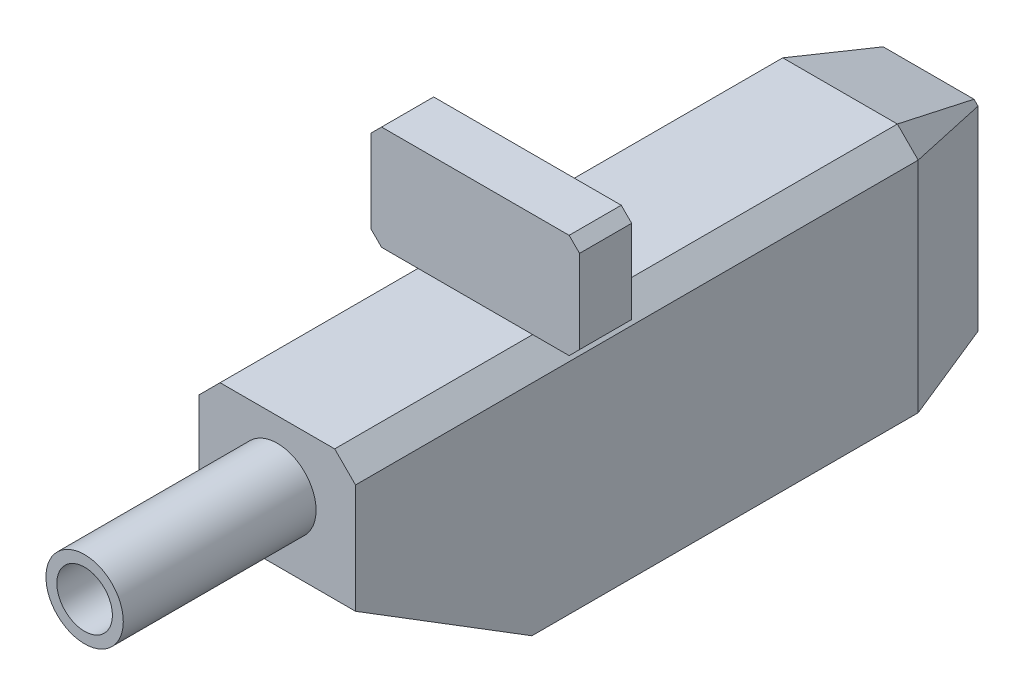
ISO-10303-21;
HEADER;
FILE_DESCRIPTION(('STEP AP214'),'2;1');
FILE_NAME('part.step','',(''),(''),'','','');
FILE_SCHEMA(('AUTOMOTIVE_DESIGN { 1 0 10303 214 1 1 1 1 }'));
ENDSEC;
DATA;
#1=APPLICATION_CONTEXT('core data for automotive mechanical design processes');
#2=APPLICATION_PROTOCOL_DEFINITION('international standard','automotive_design',2000,#1);
#3=PRODUCT_CONTEXT('',#1,'mechanical');
#4=PRODUCT('Part','Part','',(#3));
#5=PRODUCT_RELATED_PRODUCT_CATEGORY('part','',(#4));
#6=PRODUCT_DEFINITION_FORMATION('','',#4);
#7=PRODUCT_DEFINITION_CONTEXT('part definition',#1,'design');
#8=PRODUCT_DEFINITION('design','',#6,#7);
#9=PRODUCT_DEFINITION_SHAPE('','',#8);
#10=(LENGTH_UNIT() NAMED_UNIT(*) SI_UNIT(.MILLI.,.METRE.));
#11=(NAMED_UNIT(*) PLANE_ANGLE_UNIT() SI_UNIT($,.RADIAN.));
#12=(NAMED_UNIT(*) SI_UNIT($,.STERADIAN.) SOLID_ANGLE_UNIT());
#13=UNCERTAINTY_MEASURE_WITH_UNIT(LENGTH_MEASURE(1.E-05),#10,'distance_accuracy_value','');
#14=(GEOMETRIC_REPRESENTATION_CONTEXT(3) GLOBAL_UNCERTAINTY_ASSIGNED_CONTEXT((#13)) GLOBAL_UNIT_ASSIGNED_CONTEXT((#10,
#11,#12)) REPRESENTATION_CONTEXT('',''));
#15=CARTESIAN_POINT('',(0.,0.,0.));
#16=DIRECTION('',(0.,0.,1.));
#17=DIRECTION('',(1.,0.,0.));
#18=AXIS2_PLACEMENT_3D('',#15,#16,#17);
#19=CARTESIAN_POINT('',(-15.,21.,108.));
#20=DIRECTION('',(1.,0.,0.));
#21=DIRECTION('',(0.,1.,0.));
#22=AXIS2_PLACEMENT_3D('',#19,#20,#21);
#23=PLANE('',#22);
#24=DIRECTION('',(0.,-0.527017031886595,-0.849854721762163));
#25=VECTOR('',#24,1.);
#26=CARTESIAN_POINT('',(-15.,0.,108.));
#27=LINE('',#26,#25);
#28=CARTESIAN_POINT('',(-15.,0.,108.));
#29=VERTEX_POINT('',#28);
#30=CARTESIAN_POINT('',(-15.,-21.,74.1359157727454));
#31=VERTEX_POINT('',#30);
#32=EDGE_CURVE('E340',#29,#31,#27,.T.);
#33=ORIENTED_EDGE('',*,*,#32,.F.);
#34=DIRECTION('',(0.,-1.,0.));
#35=VECTOR('',#34,1.);
#36=CARTESIAN_POINT('',(-15.,21.,108.));
#37=LINE('',#36,#35);
#38=CARTESIAN_POINT('',(-15.,21.,108.));
#39=VERTEX_POINT('',#38);
#40=EDGE_CURVE('E248',#39,#29,#37,.T.);
#41=ORIENTED_EDGE('',*,*,#40,.F.);
#42=DIRECTION('',(0.,0.,-1.));
#43=VECTOR('',#42,1.);
#44=CARTESIAN_POINT('',(-15.,21.,108.));
#45=LINE('',#44,#43);
#46=CARTESIAN_POINT('',(-15.,21.,0.));
#47=VERTEX_POINT('',#46);
#48=EDGE_CURVE('E249',#39,#47,#45,.T.);
#49=ORIENTED_EDGE('',*,*,#48,.T.);
#50=DIRECTION('',(0.,-1.,0.));
#51=VECTOR('',#50,1.);
#52=CARTESIAN_POINT('',(-15.,21.,0.));
#53=LINE('',#52,#51);
#54=CARTESIAN_POINT('',(-15.,-21.,0.));
#55=VERTEX_POINT('',#54);
#56=EDGE_CURVE('E300',#47,#55,#53,.T.);
#57=ORIENTED_EDGE('',*,*,#56,.T.);
#58=DIRECTION('',(0.,0.,-1.));
#59=VECTOR('',#58,1.);
#60=CARTESIAN_POINT('',(-15.,-21.,108.));
#61=LINE('',#60,#59);
#62=EDGE_CURVE('E45',#31,#55,#61,.T.);
#63=ORIENTED_EDGE('',*,*,#62,.F.);
#64=EDGE_LOOP('',(#33,#41,#49,#57,#63));
#65=FACE_BOUND('',#64,.T.);
#66=ADVANCED_FACE('F39',(#65),#23,.F.);
#67=CARTESIAN_POINT('',(-15.,-21.,108.));
#68=DIRECTION('',(0.707106781186547,0.707106781186548,0.));
#69=DIRECTION('',(-0.707106781186548,0.707106781186547,0.));
#70=AXIS2_PLACEMENT_3D('',#67,#68,#69);
#71=PLANE('',#70);
#72=DIRECTION('',(0.466232156516168,-0.466232156516167,-0.751834524653243));
#73=VECTOR('',#72,1.);
#74=CARTESIAN_POINT('',(-23.8269268964721,-12.1730731035279,88.3700012913145));
#75=LINE('',#74,#73);
#76=CARTESIAN_POINT('',(-11.,-25.,67.685614015173));
#77=VERTEX_POINT('',#76);
#78=EDGE_CURVE('E210',#31,#77,#75,.T.);
#79=ORIENTED_EDGE('',*,*,#78,.F.);
#80=ORIENTED_EDGE('',*,*,#62,.T.);
#81=DIRECTION('',(0.707106781186548,-0.707106781186547,0.));
#82=VECTOR('',#81,1.);
#83=CARTESIAN_POINT('',(-15.,-21.,0.));
#84=LINE('',#83,#82);
#85=CARTESIAN_POINT('',(-11.,-25.,0.));
#86=VERTEX_POINT('',#85);
#87=EDGE_CURVE('E240',#55,#86,#84,.T.);
#88=ORIENTED_EDGE('',*,*,#87,.T.);
#89=DIRECTION('',(0.,0.,-1.));
#90=VECTOR('',#89,1.);
#91=CARTESIAN_POINT('',(-11.,-25.,108.));
#92=LINE('',#91,#90);
#93=EDGE_CURVE('E264',#77,#86,#92,.T.);
#94=ORIENTED_EDGE('',*,*,#93,.F.);
#95=EDGE_LOOP('',(#79,#80,#88,#94));
#96=FACE_BOUND('',#95,.T.);
#97=ADVANCED_FACE('F296',(#96),#71,.F.);
#98=CARTESIAN_POINT('',(15.,-21.,108.));
#99=DIRECTION('',(-0.707106781186547,0.707106781186548,0.));
#100=DIRECTION('',(-0.707106781186548,-0.707106781186547,0.));
#101=AXIS2_PLACEMENT_3D('',#98,#99,#100);
#102=PLANE('',#101);
#103=DIRECTION('',(0.466232156516168,0.466232156516167,0.751834524653243));
#104=VECTOR('',#103,1.);
#105=CARTESIAN_POINT('',(32.5222585921083,-3.47774140789169,102.391879621074));
#106=LINE('',#105,#104);
#107=CARTESIAN_POINT('',(11.,-25.,67.685614015173));
#108=VERTEX_POINT('',#107);
#109=CARTESIAN_POINT('',(15.,-21.,74.1359157727454));
#110=VERTEX_POINT('',#109);
#111=EDGE_CURVE('E341',#108,#110,#106,.T.);
#112=ORIENTED_EDGE('',*,*,#111,.F.);
#113=DIRECTION('',(0.,0.,-1.));
#114=VECTOR('',#113,1.);
#115=CARTESIAN_POINT('',(11.,-25.,108.));
#116=LINE('',#115,#114);
#117=CARTESIAN_POINT('',(11.,-25.,0.));
#118=VERTEX_POINT('',#117);
#119=EDGE_CURVE('E226',#108,#118,#116,.T.);
#120=ORIENTED_EDGE('',*,*,#119,.T.);
#121=DIRECTION('',(0.707106781186548,0.707106781186547,0.));
#122=VECTOR('',#121,1.);
#123=CARTESIAN_POINT('',(15.,-21.,0.));
#124=LINE('',#123,#122);
#125=CARTESIAN_POINT('',(15.,-21.,0.));
#126=VERTEX_POINT('',#125);
#127=EDGE_CURVE('E202',#118,#126,#124,.T.);
#128=ORIENTED_EDGE('',*,*,#127,.T.);
#129=DIRECTION('',(0.,0.,-1.));
#130=VECTOR('',#129,1.);
#131=CARTESIAN_POINT('',(15.,-21.,108.));
#132=LINE('',#131,#130);
#133=EDGE_CURVE('E223',#110,#126,#132,.T.);
#134=ORIENTED_EDGE('',*,*,#133,.F.);
#135=EDGE_LOOP('',(#112,#120,#128,#134));
#136=FACE_BOUND('',#135,.T.);
#137=ADVANCED_FACE('F235',(#136),#102,.F.);
#138=CARTESIAN_POINT('',(15.,21.,108.));
#139=DIRECTION('',(-1.,0.,0.));
#140=DIRECTION('',(0.,-1.,0.));
#141=AXIS2_PLACEMENT_3D('',#138,#139,#140);
#142=PLANE('',#141);
#143=DIRECTION('',(0.,0.527017031886595,0.849854721762164));
#144=VECTOR('',#143,1.);
#145=CARTESIAN_POINT('',(15.,0.,108.));
#146=LINE('',#145,#144);
#147=CARTESIAN_POINT('',(15.,0.,108.));
#148=VERTEX_POINT('',#147);
#149=EDGE_CURVE('E60',#110,#148,#146,.T.);
#150=ORIENTED_EDGE('',*,*,#149,.F.);
#151=ORIENTED_EDGE('',*,*,#133,.T.);
#152=DIRECTION('',(0.,1.,0.));
#153=VECTOR('',#152,1.);
#154=CARTESIAN_POINT('',(15.,21.,0.));
#155=LINE('',#154,#153);
#156=CARTESIAN_POINT('',(15.,21.,0.));
#157=VERTEX_POINT('',#156);
#158=EDGE_CURVE('E215',#126,#157,#155,.T.);
#159=ORIENTED_EDGE('',*,*,#158,.T.);
#160=DIRECTION('',(0.,0.,-1.));
#161=VECTOR('',#160,1.);
#162=CARTESIAN_POINT('',(15.,21.,108.));
#163=LINE('',#162,#161);
#164=CARTESIAN_POINT('',(15.,21.,108.));
#165=VERTEX_POINT('',#164);
#166=EDGE_CURVE('E230',#165,#157,#163,.T.);
#167=ORIENTED_EDGE('',*,*,#166,.F.);
#168=DIRECTION('',(0.,1.,0.));
#169=VECTOR('',#168,1.);
#170=CARTESIAN_POINT('',(15.,21.,108.));
#171=LINE('',#170,#169);
#172=EDGE_CURVE('E286',#148,#165,#171,.T.);
#173=ORIENTED_EDGE('',*,*,#172,.F.);
#174=EDGE_LOOP('',(#150,#151,#159,#167,#173));
#175=FACE_BOUND('',#174,.T.);
#176=ADVANCED_FACE('F224',(#175),#142,.F.);
#177=CARTESIAN_POINT('',(-11.,25.,108.));
#178=DIRECTION('',(0.,-1.,0.));
#179=DIRECTION('',(0.,0.,-1.));
#180=AXIS2_PLACEMENT_3D('',#177,#178,#179);
#181=PLANE('',#180);
#182=DIRECTION('',(-1.,0.,0.));
#183=VECTOR('',#182,1.);
#184=CARTESIAN_POINT('',(18.,25.,60.0000000000001));
#185=LINE('',#184,#183);
#186=CARTESIAN_POINT('',(11.,25.,60.0000000000001));
#187=VERTEX_POINT('',#186);
#188=CARTESIAN_POINT('',(-11.,25.,60.0000000000001));
#189=VERTEX_POINT('',#188);
#190=EDGE_CURVE('E50',#187,#189,#185,.T.);
#191=ORIENTED_EDGE('',*,*,#190,.F.);
#192=DIRECTION('',(0.,0.,-1.));
#193=VECTOR('',#192,1.);
#194=CARTESIAN_POINT('',(11.,25.,108.));
#195=LINE('',#194,#193);
#196=CARTESIAN_POINT('',(11.,25.,0.));
#197=VERTEX_POINT('',#196);
#198=EDGE_CURVE('E259',#187,#197,#195,.T.);
#199=ORIENTED_EDGE('',*,*,#198,.T.);
#200=DIRECTION('',(-1.,0.,0.));
#201=VECTOR('',#200,1.);
#202=CARTESIAN_POINT('',(-11.,25.,0.));
#203=LINE('',#202,#201);
#204=CARTESIAN_POINT('',(-11.,25.,0.));
#205=VERTEX_POINT('',#204);
#206=EDGE_CURVE('E243',#197,#205,#203,.T.);
#207=ORIENTED_EDGE('',*,*,#206,.T.);
#208=DIRECTION('',(0.,0.,-1.));
#209=VECTOR('',#208,1.);
#210=CARTESIAN_POINT('',(-11.,25.,108.));
#211=LINE('',#210,#209);
#212=EDGE_CURVE('E254',#189,#205,#211,.T.);
#213=ORIENTED_EDGE('',*,*,#212,.F.);
#214=EDGE_LOOP('',(#191,#199,#207,#213));
#215=FACE_BOUND('',#214,.T.);
#216=ADVANCED_FACE('F459',(#215),#181,.F.);
#217=CARTESIAN_POINT('',(-11.,-25.,108.));
#218=DIRECTION('',(0.,1.,0.));
#219=DIRECTION('',(0.,0.,1.));
#220=AXIS2_PLACEMENT_3D('',#217,#218,#219);
#221=PLANE('',#220);
#222=ORIENTED_EDGE('',*,*,#119,.F.);
#223=DIRECTION('',(-1.,0.,0.));
#224=VECTOR('',#223,1.);
#225=CARTESIAN_POINT('',(20.001,-25.,67.685614015173));
#226=LINE('',#225,#224);
#227=EDGE_CURVE('E338',#108,#77,#226,.T.);
#228=ORIENTED_EDGE('',*,*,#227,.T.);
#229=ORIENTED_EDGE('',*,*,#93,.T.);
#230=DIRECTION('',(1.,0.,0.));
#231=VECTOR('',#230,1.);
#232=CARTESIAN_POINT('',(-11.,-25.,0.));
#233=LINE('',#232,#231);
#234=EDGE_CURVE('E232',#86,#118,#233,.T.);
#235=ORIENTED_EDGE('',*,*,#234,.T.);
#236=EDGE_LOOP('',(#222,#228,#229,#235));
#237=FACE_BOUND('',#236,.T.);
#238=ADVANCED_FACE('F578',(#237),#221,.F.);
#239=CARTESIAN_POINT('',(11.,25.,108.));
#240=DIRECTION('',(-0.707106781186548,-0.707106781186548,0.));
#241=DIRECTION('',(0.707106781186548,-0.707106781186548,0.));
#242=AXIS2_PLACEMENT_3D('',#239,#240,#241);
#243=PLANE('',#242);
#244=DIRECTION('',(-0.707106781186548,0.707106781186548,0.));
#245=VECTOR('',#244,1.);
#246=CARTESIAN_POINT('',(11.,25.,0.));
#247=LINE('',#246,#245);
#248=EDGE_CURVE('E219',#157,#197,#247,.T.);
#249=ORIENTED_EDGE('',*,*,#248,.T.);
#250=ORIENTED_EDGE('',*,*,#198,.F.);
#251=CARTESIAN_POINT('',(11.,25.,70.));
#252=VERTEX_POINT('',#251);
#253=EDGE_CURVE('E262',#252,#187,#195,.T.);
#254=ORIENTED_EDGE('',*,*,#253,.F.);
#255=CARTESIAN_POINT('',(11.,25.,108.));
#256=VERTEX_POINT('',#255);
#257=EDGE_CURVE('E258',#256,#252,#195,.T.);
#258=ORIENTED_EDGE('',*,*,#257,.F.);
#259=DIRECTION('',(-0.707106781186548,0.707106781186548,0.));
#260=VECTOR('',#259,1.);
#261=CARTESIAN_POINT('',(11.,25.,108.));
#262=LINE('',#261,#260);
#263=EDGE_CURVE('E292',#165,#256,#262,.T.);
#264=ORIENTED_EDGE('',*,*,#263,.F.);
#265=ORIENTED_EDGE('',*,*,#166,.T.);
#266=EDGE_LOOP('',(#249,#250,#254,#258,#264,#265));
#267=FACE_BOUND('',#266,.T.);
#268=ADVANCED_FACE('F463',(#267),#243,.F.);
#269=ORIENTED_EDGE('',*,*,#257,.T.);
#270=DIRECTION('',(-1.,0.,0.));
#271=VECTOR('',#270,1.);
#272=CARTESIAN_POINT('',(18.,25.,70.));
#273=LINE('',#272,#271);
#274=CARTESIAN_POINT('',(-11.,25.,70.));
#275=VERTEX_POINT('',#274);
#276=EDGE_CURVE('E11',#252,#275,#273,.T.);
#277=ORIENTED_EDGE('',*,*,#276,.T.);
#278=CARTESIAN_POINT('',(-11.,25.,108.));
#279=VERTEX_POINT('',#278);
#280=EDGE_CURVE('E253',#279,#275,#211,.T.);
#281=ORIENTED_EDGE('',*,*,#280,.F.);
#282=DIRECTION('',(-1.,0.,0.));
#283=VECTOR('',#282,1.);
#284=CARTESIAN_POINT('',(-11.,25.,108.));
#285=LINE('',#284,#283);
#286=EDGE_CURVE('E295',#256,#279,#285,.T.);
#287=ORIENTED_EDGE('',*,*,#286,.F.);
#288=EDGE_LOOP('',(#269,#277,#281,#287));
#289=FACE_BOUND('',#288,.T.);
#290=ADVANCED_FACE('F466',(#289),#181,.F.);
#291=CARTESIAN_POINT('',(-11.,25.,108.));
#292=DIRECTION('',(0.707106781186548,-0.707106781186548,0.));
#293=DIRECTION('',(0.707106781186548,0.707106781186548,0.));
#294=AXIS2_PLACEMENT_3D('',#291,#292,#293);
#295=PLANE('',#294);
#296=DIRECTION('',(-0.707106781186548,-0.707106781186548,0.));
#297=VECTOR('',#296,1.);
#298=CARTESIAN_POINT('',(-11.,25.,0.));
#299=LINE('',#298,#297);
#300=EDGE_CURVE('E246',#205,#47,#299,.T.);
#301=ORIENTED_EDGE('',*,*,#300,.T.);
#302=ORIENTED_EDGE('',*,*,#48,.F.);
#303=DIRECTION('',(-0.707106781186548,-0.707106781186548,0.));
#304=VECTOR('',#303,1.);
#305=CARTESIAN_POINT('',(-11.,25.,108.));
#306=LINE('',#305,#304);
#307=EDGE_CURVE('E251',#279,#39,#306,.T.);
#308=ORIENTED_EDGE('',*,*,#307,.F.);
#309=ORIENTED_EDGE('',*,*,#280,.T.);
#310=EDGE_CURVE('E256',#275,#189,#211,.T.);
#311=ORIENTED_EDGE('',*,*,#310,.T.);
#312=ORIENTED_EDGE('',*,*,#212,.T.);
#313=EDGE_LOOP('',(#301,#302,#308,#309,#311,#312));
#314=FACE_BOUND('',#313,.T.);
#315=ADVANCED_FACE('F445',(#314),#295,.F.);
#316=CARTESIAN_POINT('',(0.,0.,108.));
#317=DIRECTION('',(0.,0.,1.));
#318=DIRECTION('',(1.,0.,0.));
#319=AXIS2_PLACEMENT_3D('',#316,#317,#318);
#320=PLANE('',#319);
#321=DIRECTION('',(-1.,0.,0.));
#322=VECTOR('',#321,1.);
#323=CARTESIAN_POINT('',(20.001,0.,108.));
#324=LINE('',#323,#322);
#325=EDGE_CURVE('E339',#148,#29,#324,.T.);
#326=ORIENTED_EDGE('',*,*,#325,.F.);
#327=ORIENTED_EDGE('',*,*,#172,.T.);
#328=ORIENTED_EDGE('',*,*,#263,.T.);
#329=ORIENTED_EDGE('',*,*,#286,.T.);
#330=ORIENTED_EDGE('',*,*,#307,.T.);
#331=ORIENTED_EDGE('',*,*,#40,.T.);
#332=EDGE_LOOP('',(#326,#327,#328,#329,#330,#331));
#333=FACE_BOUND('',#332,.T.);
#334=CARTESIAN_POINT('',(0.,13.0036412121435,108.));
#335=DIRECTION('',(0.,0.,1.));
#336=DIRECTION('',(1.,0.,0.));
#337=AXIS2_PLACEMENT_3D('',#334,#335,#336);
#338=CIRCLE('',#337,7.42429873613658);
#339=CARTESIAN_POINT('',(7.42429873613658,13.0036412121435,108.));
#340=VERTEX_POINT('',#339);
#341=EDGE_CURVE('E275',#340,#340,#338,.T.);
#342=ORIENTED_EDGE('',*,*,#341,.F.);
#343=EDGE_LOOP('',(#342));
#344=FACE_BOUND('',#343,.T.);
#345=ADVANCED_FACE('F423',(#333,#344),#320,.T.);
#346=CARTESIAN_POINT('',(0.,13.0036412121435,145.));
#347=DIRECTION('',(0.,0.,1.));
#348=DIRECTION('',(1.,0.,0.));
#349=AXIS2_PLACEMENT_3D('',#346,#347,#348);
#350=PLANE('',#349);
#351=CARTESIAN_POINT('',(0.,13.0036412121435,145.));
#352=DIRECTION('',(0.,0.,1.));
#353=DIRECTION('',(1.,0.,0.));
#354=AXIS2_PLACEMENT_3D('',#351,#352,#353);
#355=CIRCLE('',#354,7.42429873613658);
#356=CARTESIAN_POINT('',(7.42429873613658,13.0036412121435,145.));
#357=VERTEX_POINT('',#356);
#358=EDGE_CURVE('E287',#357,#357,#355,.T.);
#359=ORIENTED_EDGE('',*,*,#358,.T.);
#360=EDGE_LOOP('',(#359));
#361=FACE_BOUND('',#360,.T.);
#362=CARTESIAN_POINT('',(0.,13.0036412121435,145.));
#363=DIRECTION('',(0.,0.,1.));
#364=DIRECTION('',(1.,0.,0.));
#365=AXIS2_PLACEMENT_3D('',#362,#363,#364);
#366=CIRCLE('',#365,5.33243693779864);
#367=CARTESIAN_POINT('',(5.33243693779864,13.0036412121435,145.));
#368=VERTEX_POINT('',#367);
#369=EDGE_CURVE('E401',#368,#368,#366,.T.);
#370=ORIENTED_EDGE('',*,*,#369,.F.);
#371=EDGE_LOOP('',(#370));
#372=FACE_BOUND('',#371,.T.);
#373=ADVANCED_FACE('F422',(#361,#372),#350,.T.);
#374=CARTESIAN_POINT('',(0.,13.0036412121435,145.));
#375=DIRECTION('',(0.,0.,-1.));
#376=DIRECTION('',(-1.,0.,0.));
#377=AXIS2_PLACEMENT_3D('',#374,#375,#376);
#378=CYLINDRICAL_SURFACE('',#377,7.42429873613658);
#379=ORIENTED_EDGE('',*,*,#358,.F.);
#380=EDGE_LOOP('',(#379));
#381=FACE_BOUND('',#380,.T.);
#382=ORIENTED_EDGE('',*,*,#341,.T.);
#383=EDGE_LOOP('',(#382));
#384=FACE_BOUND('',#383,.T.);
#385=ADVANCED_FACE('F415',(#381,#384),#378,.T.);
#386=CARTESIAN_POINT('',(0.,13.0036412121435,145.));
#387=DIRECTION('',(0.,0.,-1.));
#388=DIRECTION('',(-1.,0.,0.));
#389=AXIS2_PLACEMENT_3D('',#386,#387,#388);
#390=CYLINDRICAL_SURFACE('',#389,5.33243693779864);
#391=ORIENTED_EDGE('',*,*,#369,.T.);
#392=EDGE_LOOP('',(#391));
#393=FACE_BOUND('',#392,.T.);
#394=CARTESIAN_POINT('',(0.,13.0036412121435,108.));
#395=DIRECTION('',(0.,0.,1.));
#396=DIRECTION('',(1.,0.,0.));
#397=AXIS2_PLACEMENT_3D('',#394,#395,#396);
#398=CIRCLE('',#397,5.33243693779864);
#399=CARTESIAN_POINT('',(5.33243693779864,13.0036412121435,108.));
#400=VERTEX_POINT('',#399);
#401=EDGE_CURVE('E405',#400,#400,#398,.T.);
#402=ORIENTED_EDGE('',*,*,#401,.F.);
#403=EDGE_LOOP('',(#402));
#404=FACE_BOUND('',#403,.T.);
#405=ADVANCED_FACE('F408',(#393,#404),#390,.F.);
#406=ORIENTED_EDGE('',*,*,#401,.T.);
#407=EDGE_LOOP('',(#406));
#408=FACE_BOUND('',#407,.T.);
#409=ADVANCED_FACE('F409',(#408),#320,.T.);
#410=CARTESIAN_POINT('',(18.,25.,60.0000000000001));
#411=DIRECTION('',(0.,1.,0.));
#412=DIRECTION('',(0.,0.,1.));
#413=AXIS2_PLACEMENT_3D('',#410,#411,#412);
#414=PLANE('',#413);
#415=CARTESIAN_POINT('',(18.,25.,70.));
#416=VERTEX_POINT('',#415);
#417=EDGE_CURVE('E47',#416,#252,#273,.T.);
#418=ORIENTED_EDGE('',*,*,#417,.T.);
#419=ORIENTED_EDGE('',*,*,#253,.T.);
#420=CARTESIAN_POINT('',(18.,25.,60.0000000000001));
#421=VERTEX_POINT('',#420);
#422=EDGE_CURVE('E285',#421,#187,#185,.T.);
#423=ORIENTED_EDGE('',*,*,#422,.F.);
#424=DIRECTION('',(0.,0.,1.));
#425=VECTOR('',#424,1.);
#426=CARTESIAN_POINT('',(18.,25.,60.0000000000001));
#427=LINE('',#426,#425);
#428=EDGE_CURVE('E392',#421,#416,#427,.T.);
#429=ORIENTED_EDGE('',*,*,#428,.T.);
#430=EDGE_LOOP('',(#418,#419,#423,#429));
#431=FACE_BOUND('',#430,.T.);
#432=ADVANCED_FACE('F419',(#431),#414,.F.);
#433=CARTESIAN_POINT('',(18.,45.,60.0000000000001));
#434=DIRECTION('',(-0.707106781186547,-0.707106781186548,0.));
#435=DIRECTION('',(0.707106781186548,-0.707106781186547,0.));
#436=AXIS2_PLACEMENT_3D('',#433,#434,#435);
#437=PLANE('',#436);
#438=DIRECTION('',(0.707106781186548,-0.707106781186547,0.));
#439=VECTOR('',#438,1.);
#440=CARTESIAN_POINT('',(18.,45.,70.));
#441=LINE('',#440,#439);
#442=CARTESIAN_POINT('',(18.,45.,70.));
#443=VERTEX_POINT('',#442);
#444=CARTESIAN_POINT('',(20.,43.,70.));
#445=VERTEX_POINT('',#444);
#446=EDGE_CURVE('E346',#443,#445,#441,.T.);
#447=ORIENTED_EDGE('',*,*,#446,.T.);
#448=DIRECTION('',(0.,0.,1.));
#449=VECTOR('',#448,1.);
#450=CARTESIAN_POINT('',(20.,43.,60.0000000000001));
#451=LINE('',#450,#449);
#452=CARTESIAN_POINT('',(20.,43.,60.0000000000001));
#453=VERTEX_POINT('',#452);
#454=EDGE_CURVE('E399',#453,#445,#451,.T.);
#455=ORIENTED_EDGE('',*,*,#454,.F.);
#456=DIRECTION('',(0.707106781186548,-0.707106781186547,0.));
#457=VECTOR('',#456,1.);
#458=CARTESIAN_POINT('',(18.,45.,60.0000000000001));
#459=LINE('',#458,#457);
#460=CARTESIAN_POINT('',(18.,45.,60.0000000000001));
#461=VERTEX_POINT('',#460);
#462=EDGE_CURVE('E350',#461,#453,#459,.T.);
#463=ORIENTED_EDGE('',*,*,#462,.F.);
#464=DIRECTION('',(0.,0.,1.));
#465=VECTOR('',#464,1.);
#466=CARTESIAN_POINT('',(18.,45.,60.0000000000001));
#467=LINE('',#466,#465);
#468=EDGE_CURVE('E364',#461,#443,#467,.T.);
#469=ORIENTED_EDGE('',*,*,#468,.T.);
#470=EDGE_LOOP('',(#447,#455,#463,#469));
#471=FACE_BOUND('',#470,.T.);
#472=ADVANCED_FACE('F510',(#471),#437,.F.);
#473=CARTESIAN_POINT('',(20.,43.,60.0000000000001));
#474=DIRECTION('',(-1.,0.,0.));
#475=DIRECTION('',(0.,0.,1.));
#476=AXIS2_PLACEMENT_3D('',#473,#474,#475);
#477=PLANE('',#476);
#478=DIRECTION('',(0.,-1.,0.));
#479=VECTOR('',#478,1.);
#480=CARTESIAN_POINT('',(20.,43.,70.));
#481=LINE('',#480,#479);
#482=CARTESIAN_POINT('',(20.,27.,70.));
#483=VERTEX_POINT('',#482);
#484=EDGE_CURVE('E370',#445,#483,#481,.T.);
#485=ORIENTED_EDGE('',*,*,#484,.T.);
#486=DIRECTION('',(0.,0.,1.));
#487=VECTOR('',#486,1.);
#488=CARTESIAN_POINT('',(20.,27.,60.0000000000001));
#489=LINE('',#488,#487);
#490=CARTESIAN_POINT('',(20.,27.,60.0000000000001));
#491=VERTEX_POINT('',#490);
#492=EDGE_CURVE('E397',#491,#483,#489,.T.);
#493=ORIENTED_EDGE('',*,*,#492,.F.);
#494=DIRECTION('',(0.,-1.,0.));
#495=VECTOR('',#494,1.);
#496=CARTESIAN_POINT('',(20.,43.,60.0000000000001));
#497=LINE('',#496,#495);
#498=EDGE_CURVE('E349',#453,#491,#497,.T.);
#499=ORIENTED_EDGE('',*,*,#498,.F.);
#500=ORIENTED_EDGE('',*,*,#454,.T.);
#501=EDGE_LOOP('',(#485,#493,#499,#500));
#502=FACE_BOUND('',#501,.T.);
#503=ADVANCED_FACE('F503',(#502),#477,.F.);
#504=CARTESIAN_POINT('',(20.,27.,60.0000000000001));
#505=DIRECTION('',(-0.707106781186547,0.707106781186548,0.));
#506=DIRECTION('',(-0.707106781186548,-0.707106781186547,0.));
#507=AXIS2_PLACEMENT_3D('',#504,#505,#506);
#508=PLANE('',#507);
#509=DIRECTION('',(-0.707106781186548,-0.707106781186547,0.));
#510=VECTOR('',#509,1.);
#511=CARTESIAN_POINT('',(20.,27.,70.));
#512=LINE('',#511,#510);
#513=EDGE_CURVE('E367',#483,#416,#512,.T.);
#514=ORIENTED_EDGE('',*,*,#513,.T.);
#515=ORIENTED_EDGE('',*,*,#428,.F.);
#516=DIRECTION('',(-0.707106781186548,-0.707106781186547,0.));
#517=VECTOR('',#516,1.);
#518=CARTESIAN_POINT('',(20.,27.,60.0000000000001));
#519=LINE('',#518,#517);
#520=EDGE_CURVE('E353',#491,#421,#519,.T.);
#521=ORIENTED_EDGE('',*,*,#520,.F.);
#522=ORIENTED_EDGE('',*,*,#492,.T.);
#523=EDGE_LOOP('',(#514,#515,#521,#522));
#524=FACE_BOUND('',#523,.T.);
#525=ADVANCED_FACE('F499',(#524),#508,.F.);
#526=ORIENTED_EDGE('',*,*,#310,.F.);
#527=CARTESIAN_POINT('',(-18.,25.,70.));
#528=VERTEX_POINT('',#527);
#529=EDGE_CURVE('E49',#275,#528,#273,.T.);
#530=ORIENTED_EDGE('',*,*,#529,.T.);
#531=DIRECTION('',(0.,0.,1.));
#532=VECTOR('',#531,1.);
#533=CARTESIAN_POINT('',(-18.,25.,60.0000000000001));
#534=LINE('',#533,#532);
#535=CARTESIAN_POINT('',(-18.,25.,60.0000000000001));
#536=VERTEX_POINT('',#535);
#537=EDGE_CURVE('E388',#536,#528,#534,.T.);
#538=ORIENTED_EDGE('',*,*,#537,.F.);
#539=EDGE_CURVE('E282',#189,#536,#185,.T.);
#540=ORIENTED_EDGE('',*,*,#539,.F.);
#541=EDGE_LOOP('',(#526,#530,#538,#540));
#542=FACE_BOUND('',#541,.T.);
#543=ADVANCED_FACE('F474',(#542),#414,.F.);
#544=CARTESIAN_POINT('',(-20.,27.,60.0000000000001));
#545=DIRECTION('',(0.707106781186548,0.707106781186547,0.));
#546=DIRECTION('',(-0.707106781186547,0.707106781186548,0.));
#547=AXIS2_PLACEMENT_3D('',#544,#545,#546);
#548=PLANE('',#547);
#549=DIRECTION('',(-0.707106781186547,0.707106781186548,0.));
#550=VECTOR('',#549,1.);
#551=CARTESIAN_POINT('',(-20.,27.,70.));
#552=LINE('',#551,#550);
#553=CARTESIAN_POINT('',(-20.,27.,70.));
#554=VERTEX_POINT('',#553);
#555=EDGE_CURVE('E375',#528,#554,#552,.T.);
#556=ORIENTED_EDGE('',*,*,#555,.T.);
#557=DIRECTION('',(0.,0.,1.));
#558=VECTOR('',#557,1.);
#559=CARTESIAN_POINT('',(-20.,27.,60.0000000000001));
#560=LINE('',#559,#558);
#561=CARTESIAN_POINT('',(-20.,27.,60.0000000000001));
#562=VERTEX_POINT('',#561);
#563=EDGE_CURVE('E390',#562,#554,#560,.T.);
#564=ORIENTED_EDGE('',*,*,#563,.F.);
#565=DIRECTION('',(-0.707106781186547,0.707106781186548,0.));
#566=VECTOR('',#565,1.);
#567=CARTESIAN_POINT('',(-20.,27.,60.0000000000001));
#568=LINE('',#567,#566);
#569=EDGE_CURVE('E358',#536,#562,#568,.T.);
#570=ORIENTED_EDGE('',*,*,#569,.F.);
#571=ORIENTED_EDGE('',*,*,#537,.T.);
#572=EDGE_LOOP('',(#556,#564,#570,#571));
#573=FACE_BOUND('',#572,.T.);
#574=ADVANCED_FACE('F484',(#573),#548,.F.);
#575=CARTESIAN_POINT('',(-20.,43.,60.0000000000001));
#576=DIRECTION('',(1.,0.,0.));
#577=DIRECTION('',(0.,1.,0.));
#578=AXIS2_PLACEMENT_3D('',#575,#576,#577);
#579=PLANE('',#578);
#580=DIRECTION('',(0.,1.,0.));
#581=VECTOR('',#580,1.);
#582=CARTESIAN_POINT('',(-20.,43.,70.));
#583=LINE('',#582,#581);
#584=CARTESIAN_POINT('',(-20.,43.,70.));
#585=VERTEX_POINT('',#584);
#586=EDGE_CURVE('E372',#554,#585,#583,.T.);
#587=ORIENTED_EDGE('',*,*,#586,.T.);
#588=DIRECTION('',(0.,0.,1.));
#589=VECTOR('',#588,1.);
#590=CARTESIAN_POINT('',(-20.,43.,60.0000000000001));
#591=LINE('',#590,#589);
#592=CARTESIAN_POINT('',(-20.,43.,60.0000000000001));
#593=VERTEX_POINT('',#592);
#594=EDGE_CURVE('E381',#593,#585,#591,.T.);
#595=ORIENTED_EDGE('',*,*,#594,.F.);
#596=DIRECTION('',(0.,1.,0.));
#597=VECTOR('',#596,1.);
#598=CARTESIAN_POINT('',(-20.,43.,60.0000000000001));
#599=LINE('',#598,#597);
#600=EDGE_CURVE('E356',#562,#593,#599,.T.);
#601=ORIENTED_EDGE('',*,*,#600,.F.);
#602=ORIENTED_EDGE('',*,*,#563,.T.);
#603=EDGE_LOOP('',(#587,#595,#601,#602));
#604=FACE_BOUND('',#603,.T.);
#605=ADVANCED_FACE('F486',(#604),#579,.F.);
#606=CARTESIAN_POINT('',(-18.,45.,60.0000000000001));
#607=DIRECTION('',(0.707106781186547,-0.707106781186547,0.));
#608=DIRECTION('',(0.707106781186548,0.707106781186548,0.));
#609=AXIS2_PLACEMENT_3D('',#606,#607,#608);
#610=PLANE('',#609);
#611=DIRECTION('',(0.707106781186547,0.707106781186547,0.));
#612=VECTOR('',#611,1.);
#613=CARTESIAN_POINT('',(-18.,45.,70.));
#614=LINE('',#613,#612);
#615=CARTESIAN_POINT('',(-18.,45.,70.));
#616=VERTEX_POINT('',#615);
#617=EDGE_CURVE('E376',#585,#616,#614,.T.);
#618=ORIENTED_EDGE('',*,*,#617,.T.);
#619=DIRECTION('',(0.,0.,1.));
#620=VECTOR('',#619,1.);
#621=CARTESIAN_POINT('',(-18.,45.,60.0000000000001));
#622=LINE('',#621,#620);
#623=CARTESIAN_POINT('',(-18.,45.,60.0000000000001));
#624=VERTEX_POINT('',#623);
#625=EDGE_CURVE('E382',#624,#616,#622,.T.);
#626=ORIENTED_EDGE('',*,*,#625,.F.);
#627=DIRECTION('',(0.707106781186547,0.707106781186547,0.));
#628=VECTOR('',#627,1.);
#629=CARTESIAN_POINT('',(-18.,45.,60.0000000000001));
#630=LINE('',#629,#628);
#631=EDGE_CURVE('E359',#593,#624,#630,.T.);
#632=ORIENTED_EDGE('',*,*,#631,.F.);
#633=ORIENTED_EDGE('',*,*,#594,.T.);
#634=EDGE_LOOP('',(#618,#626,#632,#633));
#635=FACE_BOUND('',#634,.T.);
#636=ADVANCED_FACE('F511',(#635),#610,.F.);
#637=CARTESIAN_POINT('',(18.,45.,60.0000000000001));
#638=DIRECTION('',(0.,-1.,0.));
#639=DIRECTION('',(0.,0.,-1.));
#640=AXIS2_PLACEMENT_3D('',#637,#638,#639);
#641=PLANE('',#640);
#642=DIRECTION('',(1.,0.,0.));
#643=VECTOR('',#642,1.);
#644=CARTESIAN_POINT('',(18.,45.,70.));
#645=LINE('',#644,#643);
#646=EDGE_CURVE('E352',#616,#443,#645,.T.);
#647=ORIENTED_EDGE('',*,*,#646,.T.);
#648=ORIENTED_EDGE('',*,*,#468,.F.);
#649=DIRECTION('',(1.,0.,0.));
#650=VECTOR('',#649,1.);
#651=CARTESIAN_POINT('',(18.,45.,60.0000000000001));
#652=LINE('',#651,#650);
#653=EDGE_CURVE('E365',#624,#461,#652,.T.);
#654=ORIENTED_EDGE('',*,*,#653,.F.);
#655=ORIENTED_EDGE('',*,*,#625,.T.);
#656=EDGE_LOOP('',(#647,#648,#654,#655));
#657=FACE_BOUND('',#656,.T.);
#658=ADVANCED_FACE('F512',(#657),#641,.F.);
#659=CARTESIAN_POINT('',(0.,0.,60.0000000000001));
#660=DIRECTION('',(0.,0.,-1.));
#661=DIRECTION('',(-1.,0.,0.));
#662=AXIS2_PLACEMENT_3D('',#659,#660,#661);
#663=PLANE('',#662);
#664=ORIENTED_EDGE('',*,*,#462,.T.);
#665=ORIENTED_EDGE('',*,*,#498,.T.);
#666=ORIENTED_EDGE('',*,*,#520,.T.);
#667=ORIENTED_EDGE('',*,*,#422,.T.);
#668=ORIENTED_EDGE('',*,*,#190,.T.);
#669=ORIENTED_EDGE('',*,*,#539,.T.);
#670=ORIENTED_EDGE('',*,*,#569,.T.);
#671=ORIENTED_EDGE('',*,*,#600,.T.);
#672=ORIENTED_EDGE('',*,*,#631,.T.);
#673=ORIENTED_EDGE('',*,*,#653,.T.);
#674=EDGE_LOOP('',(#664,#665,#666,#667,#668,#669,#670,#671,#672,#673));
#675=FACE_BOUND('',#674,.T.);
#676=ADVANCED_FACE('F495',(#675),#663,.T.);
#677=CARTESIAN_POINT('',(0.,0.,70.));
#678=DIRECTION('',(0.,0.,-1.));
#679=DIRECTION('',(-1.,0.,0.));
#680=AXIS2_PLACEMENT_3D('',#677,#678,#679);
#681=PLANE('',#680);
#682=ORIENTED_EDGE('',*,*,#446,.F.);
#683=ORIENTED_EDGE('',*,*,#646,.F.);
#684=ORIENTED_EDGE('',*,*,#617,.F.);
#685=ORIENTED_EDGE('',*,*,#586,.F.);
#686=ORIENTED_EDGE('',*,*,#555,.F.);
#687=ORIENTED_EDGE('',*,*,#529,.F.);
#688=ORIENTED_EDGE('',*,*,#276,.F.);
#689=ORIENTED_EDGE('',*,*,#417,.F.);
#690=ORIENTED_EDGE('',*,*,#513,.F.);
#691=ORIENTED_EDGE('',*,*,#484,.F.);
#692=EDGE_LOOP('',(#682,#683,#684,#685,#686,#687,#688,#689,#690,#691));
#693=FACE_BOUND('',#692,.T.);
#694=ADVANCED_FACE('F477',(#693),#681,.F.);
#695=CARTESIAN_POINT('',(20.001,0.,108.));
#696=DIRECTION('',(0.,0.849854721762163,-0.527017031886595));
#697=DIRECTION('',(0.,0.527017031886595,0.849854721762164));
#698=AXIS2_PLACEMENT_3D('',#695,#696,#697);
#699=PLANE('',#698);
#700=ORIENTED_EDGE('',*,*,#78,.T.);
#701=ORIENTED_EDGE('',*,*,#227,.F.);
#702=ORIENTED_EDGE('',*,*,#111,.T.);
#703=ORIENTED_EDGE('',*,*,#149,.T.);
#704=ORIENTED_EDGE('',*,*,#325,.T.);
#705=ORIENTED_EDGE('',*,*,#32,.T.);
#706=EDGE_LOOP('',(#700,#701,#702,#703,#704,#705));
#707=FACE_BOUND('',#706,.T.);
#708=ADVANCED_FACE('F640',(#707),#699,.F.);
#709=CARTESIAN_POINT('',(15.,-21.,0.));
#710=DIRECTION('',(0.951056516295154,0.,-0.309016994374948));
#711=DIRECTION('',(-0.309016994374948,0.,-0.951056516295154));
#712=AXIS2_PLACEMENT_3D('',#709,#710,#711);
#713=PLANE('',#712);
#714=ORIENTED_EDGE('',*,*,#158,.F.);
#715=DIRECTION('',(0.306516252557256,-0.126963188896992,0.943360024372118));
#716=VECTOR('',#715,1.);
#717=CARTESIAN_POINT('',(14.7798562711667,-20.9088134818459,-0.67753273004254));
#718=LINE('',#717,#716);
#719=CARTESIAN_POINT('',(9.47636516404063,-18.7120355373492,-16.9999999999999));
#720=VERTEX_POINT('',#719);
#721=EDGE_CURVE('E196',#720,#126,#718,.T.);
#722=ORIENTED_EDGE('',*,*,#721,.F.);
#723=DIRECTION('',(0.,1.,0.));
#724=VECTOR('',#723,1.);
#725=CARTESIAN_POINT('',(9.47636516404063,0.,-16.9999999999999));
#726=LINE('',#725,#724);
#727=CARTESIAN_POINT('',(9.47636516404063,18.7120355373491,-16.9999999999999));
#728=VERTEX_POINT('',#727);
#729=EDGE_CURVE('E325',#728,#720,#726,.F.);
#730=ORIENTED_EDGE('',*,*,#729,.F.);
#731=DIRECTION('',(0.306516252557256,0.126963188896992,0.943360024372118));
#732=VECTOR('',#731,1.);
#733=CARTESIAN_POINT('',(13.3655162033162,20.3229746439345,-5.0304238728336));
#734=LINE('',#733,#732);
#735=EDGE_CURVE('E216',#728,#157,#734,.T.);
#736=ORIENTED_EDGE('',*,*,#735,.T.);
#737=EDGE_LOOP('',(#714,#722,#730,#736));
#738=FACE_BOUND('',#737,.T.);
#739=ADVANCED_FACE('F211',(#738),#713,.T.);
#740=CARTESIAN_POINT('',(11.,-25.,0.));
#741=DIRECTION('',(0.672498511963958,-0.672498511963957,-0.309016994374948));
#742=DIRECTION('',(-0.218508012224411,0.218508012224411,-0.951056516295154));
#743=AXIS2_PLACEMENT_3D('',#740,#741,#742);
#744=PLANE('',#743);
#745=ORIENTED_EDGE('',*,*,#127,.F.);
#746=DIRECTION('',(0.126963188896992,-0.306516252557256,0.943360024372118));
#747=VECTOR('',#746,1.);
#748=CARTESIAN_POINT('',(10.6453676706324,-24.1438418207847,-2.63498393338903));
#749=LINE('',#748,#747);
#750=CARTESIAN_POINT('',(8.71203553734915,-19.4763651640406,-16.9999999999999));
#751=VERTEX_POINT('',#750);
#752=EDGE_CURVE('E206',#751,#118,#749,.T.);
#753=ORIENTED_EDGE('',*,*,#752,.F.);
#754=DIRECTION('',(0.707106781186547,0.707106781186548,0.));
#755=VECTOR('',#754,1.);
#756=CARTESIAN_POINT('',(14.0942003506949,-14.0942003506949,-16.9999999999999));
#757=LINE('',#756,#755);
#758=EDGE_CURVE('E203',#720,#751,#757,.F.);
#759=ORIENTED_EDGE('',*,*,#758,.F.);
#760=ORIENTED_EDGE('',*,*,#721,.T.);
#761=EDGE_LOOP('',(#745,#753,#759,#760));
#762=FACE_BOUND('',#761,.T.);
#763=ADVANCED_FACE('F197',(#762),#744,.T.);
#764=CARTESIAN_POINT('',(-11.,-25.,0.));
#765=DIRECTION('',(0.,-0.951056516295154,-0.309016994374948));
#766=DIRECTION('',(0.,0.309016994374948,-0.951056516295154));
#767=AXIS2_PLACEMENT_3D('',#764,#765,#766);
#768=PLANE('',#767);
#769=ORIENTED_EDGE('',*,*,#234,.F.);
#770=DIRECTION('',(-0.126963188896992,-0.306516252557256,0.943360024372118));
#771=VECTOR('',#770,1.);
#772=CARTESIAN_POINT('',(-10.9088134818459,-24.7798562711667,-0.677532730042541));
#773=LINE('',#772,#771);
#774=CARTESIAN_POINT('',(-8.71203553734914,-19.4763651640406,-16.9999999999999));
#775=VERTEX_POINT('',#774);
#776=EDGE_CURVE('E310',#775,#86,#773,.T.);
#777=ORIENTED_EDGE('',*,*,#776,.F.);
#778=DIRECTION('',(1.,0.,0.));
#779=VECTOR('',#778,1.);
#780=CARTESIAN_POINT('',(0.,-19.4763651640406,-16.9999999999999));
#781=LINE('',#780,#779);
#782=EDGE_CURVE('E323',#751,#775,#781,.F.);
#783=ORIENTED_EDGE('',*,*,#782,.F.);
#784=ORIENTED_EDGE('',*,*,#752,.T.);
#785=EDGE_LOOP('',(#769,#777,#783,#784));
#786=FACE_BOUND('',#785,.T.);
#787=ADVANCED_FACE('F682',(#786),#768,.T.);
#788=CARTESIAN_POINT('',(-15.,-21.,0.));
#789=DIRECTION('',(-0.672498511963957,-0.672498511963957,-0.309016994374948));
#790=DIRECTION('',(0.218508012224411,0.218508012224411,-0.951056516295154));
#791=AXIS2_PLACEMENT_3D('',#788,#789,#790);
#792=PLANE('',#791);
#793=ORIENTED_EDGE('',*,*,#87,.F.);
#794=DIRECTION('',(-0.306516252557256,-0.126963188896992,0.943360024372118));
#795=VECTOR('',#794,1.);
#796=CARTESIAN_POINT('',(-13.3655162033161,-20.3229746439345,-5.03042387283359));
#797=LINE('',#796,#795);
#798=CARTESIAN_POINT('',(-9.47636516404062,-18.7120355373491,-16.9999999999999));
#799=VERTEX_POINT('',#798);
#800=EDGE_CURVE('E302',#799,#55,#797,.T.);
#801=ORIENTED_EDGE('',*,*,#800,.F.);
#802=DIRECTION('',(0.707106781186548,-0.707106781186547,0.));
#803=VECTOR('',#802,1.);
#804=CARTESIAN_POINT('',(-14.0942003506949,-14.0942003506949,-16.9999999999999));
#805=LINE('',#804,#803);
#806=EDGE_CURVE('E330',#775,#799,#805,.F.);
#807=ORIENTED_EDGE('',*,*,#806,.F.);
#808=ORIENTED_EDGE('',*,*,#776,.T.);
#809=EDGE_LOOP('',(#793,#801,#807,#808));
#810=FACE_BOUND('',#809,.T.);
#811=ADVANCED_FACE('F305',(#810),#792,.T.);
#812=CARTESIAN_POINT('',(-15.,21.,0.));
#813=DIRECTION('',(-0.951056516295153,0.,-0.309016994374948));
#814=DIRECTION('',(0.309016994374948,0.,-0.951056516295154));
#815=AXIS2_PLACEMENT_3D('',#812,#813,#814);
#816=PLANE('',#815);
#817=ORIENTED_EDGE('',*,*,#56,.F.);
#818=DIRECTION('',(-0.306516252557256,0.126963188896992,0.943360024372118));
#819=VECTOR('',#818,1.);
#820=CARTESIAN_POINT('',(-14.7798562711667,20.9088134818459,-0.677532730042541));
#821=LINE('',#820,#819);
#822=CARTESIAN_POINT('',(-9.47636516404063,18.7120355373491,-16.9999999999999));
#823=VERTEX_POINT('',#822);
#824=EDGE_CURVE('E313',#823,#47,#821,.T.);
#825=ORIENTED_EDGE('',*,*,#824,.F.);
#826=DIRECTION('',(0.,-1.,0.));
#827=VECTOR('',#826,1.);
#828=CARTESIAN_POINT('',(-9.47636516404062,0.,-16.9999999999999));
#829=LINE('',#828,#827);
#830=EDGE_CURVE('E312',#799,#823,#829,.F.);
#831=ORIENTED_EDGE('',*,*,#830,.F.);
#832=ORIENTED_EDGE('',*,*,#800,.T.);
#833=EDGE_LOOP('',(#817,#825,#831,#832));
#834=FACE_BOUND('',#833,.T.);
#835=ADVANCED_FACE('F309',(#834),#816,.T.);
#836=CARTESIAN_POINT('',(-11.,25.,0.));
#837=DIRECTION('',(-0.672498511963957,0.672498511963957,-0.309016994374948));
#838=DIRECTION('',(0.218508012224411,-0.218508012224411,-0.951056516295154));
#839=AXIS2_PLACEMENT_3D('',#836,#837,#838);
#840=PLANE('',#839);
#841=ORIENTED_EDGE('',*,*,#300,.F.);
#842=DIRECTION('',(-0.126963188896992,0.306516252557256,0.943360024372118));
#843=VECTOR('',#842,1.);
#844=CARTESIAN_POINT('',(-10.6453676706323,24.1438418207846,-2.63498393338903));
#845=LINE('',#844,#843);
#846=CARTESIAN_POINT('',(-8.71203553734914,19.4763651640406,-16.9999999999999));
#847=VERTEX_POINT('',#846);
#848=EDGE_CURVE('E320',#847,#205,#845,.T.);
#849=ORIENTED_EDGE('',*,*,#848,.F.);
#850=DIRECTION('',(-0.707106781186548,-0.707106781186548,0.));
#851=VECTOR('',#850,1.);
#852=CARTESIAN_POINT('',(-14.0942003506949,14.0942003506949,-16.9999999999999));
#853=LINE('',#852,#851);
#854=EDGE_CURVE('E329',#823,#847,#853,.F.);
#855=ORIENTED_EDGE('',*,*,#854,.F.);
#856=ORIENTED_EDGE('',*,*,#824,.T.);
#857=EDGE_LOOP('',(#841,#849,#855,#856));
#858=FACE_BOUND('',#857,.T.);
#859=ADVANCED_FACE('F450',(#858),#840,.T.);
#860=CARTESIAN_POINT('',(11.,25.,0.));
#861=DIRECTION('',(0.,0.951056516295154,-0.309016994374948));
#862=DIRECTION('',(0.,-0.309016994374948,-0.951056516295154));
#863=AXIS2_PLACEMENT_3D('',#860,#861,#862);
#864=PLANE('',#863);
#865=ORIENTED_EDGE('',*,*,#206,.F.);
#866=DIRECTION('',(0.126963188896992,0.306516252557256,0.943360024372118));
#867=VECTOR('',#866,1.);
#868=CARTESIAN_POINT('',(10.9088134818459,24.7798562711667,-0.677532730042541));
#869=LINE('',#868,#867);
#870=CARTESIAN_POINT('',(8.71203553734914,19.4763651640406,-16.9999999999999));
#871=VERTEX_POINT('',#870);
#872=EDGE_CURVE('E451',#871,#197,#869,.T.);
#873=ORIENTED_EDGE('',*,*,#872,.F.);
#874=DIRECTION('',(-1.,0.,0.));
#875=VECTOR('',#874,1.);
#876=CARTESIAN_POINT('',(0.,19.4763651640406,-16.9999999999999));
#877=LINE('',#876,#875);
#878=EDGE_CURVE('E335',#847,#871,#877,.F.);
#879=ORIENTED_EDGE('',*,*,#878,.F.);
#880=ORIENTED_EDGE('',*,*,#848,.T.);
#881=EDGE_LOOP('',(#865,#873,#879,#880));
#882=FACE_BOUND('',#881,.T.);
#883=ADVANCED_FACE('F452',(#882),#864,.T.);
#884=CARTESIAN_POINT('',(15.,21.,0.));
#885=DIRECTION('',(0.672498511963957,0.672498511963957,-0.309016994374948));
#886=DIRECTION('',(-0.218508012224411,-0.218508012224411,-0.951056516295154));
#887=AXIS2_PLACEMENT_3D('',#884,#885,#886);
#888=PLANE('',#887);
#889=ORIENTED_EDGE('',*,*,#248,.F.);
#890=ORIENTED_EDGE('',*,*,#735,.F.);
#891=DIRECTION('',(-0.707106781186548,0.707106781186548,0.));
#892=VECTOR('',#891,1.);
#893=CARTESIAN_POINT('',(14.0942003506949,14.0942003506949,-16.9999999999999));
#894=LINE('',#893,#892);
#895=EDGE_CURVE('E334',#871,#728,#894,.F.);
#896=ORIENTED_EDGE('',*,*,#895,.F.);
#897=ORIENTED_EDGE('',*,*,#872,.T.);
#898=EDGE_LOOP('',(#889,#890,#896,#897));
#899=FACE_BOUND('',#898,.T.);
#900=ADVANCED_FACE('F458',(#899),#888,.T.);
#901=CARTESIAN_POINT('',(0.,0.,-16.9999999999999));
#902=DIRECTION('',(0.,0.,1.));
#903=DIRECTION('',(1.,0.,0.));
#904=AXIS2_PLACEMENT_3D('',#901,#902,#903);
#905=PLANE('',#904);
#906=ORIENTED_EDGE('',*,*,#729,.T.);
#907=ORIENTED_EDGE('',*,*,#758,.T.);
#908=ORIENTED_EDGE('',*,*,#782,.T.);
#909=ORIENTED_EDGE('',*,*,#806,.T.);
#910=ORIENTED_EDGE('',*,*,#830,.T.);
#911=ORIENTED_EDGE('',*,*,#854,.T.);
#912=ORIENTED_EDGE('',*,*,#878,.T.);
#913=ORIENTED_EDGE('',*,*,#895,.T.);
#914=EDGE_LOOP('',(#906,#907,#908,#909,#910,#911,#912,#913));
#915=FACE_BOUND('',#914,.T.);
#916=ADVANCED_FACE('F727',(#915),#905,.F.);
#917=CLOSED_SHELL('',(#66,#97,#137,#176,#216,#238,#268,#290,#315,#345,#373,#385,#405,#409,#432,
#472,#503,#525,#543,#574,#605,#636,#658,#676,#694,#708,#739,#763,#787,#811,#835,#859,#883,#900,#916));
#918=MANIFOLD_SOLID_BREP('B2',#917);
#919=ADVANCED_BREP_SHAPE_REPRESENTATION('',(#18,#918),#14);
#920=SHAPE_DEFINITION_REPRESENTATION(#9,#919);
ENDSEC;
END-ISO-10303-21;
